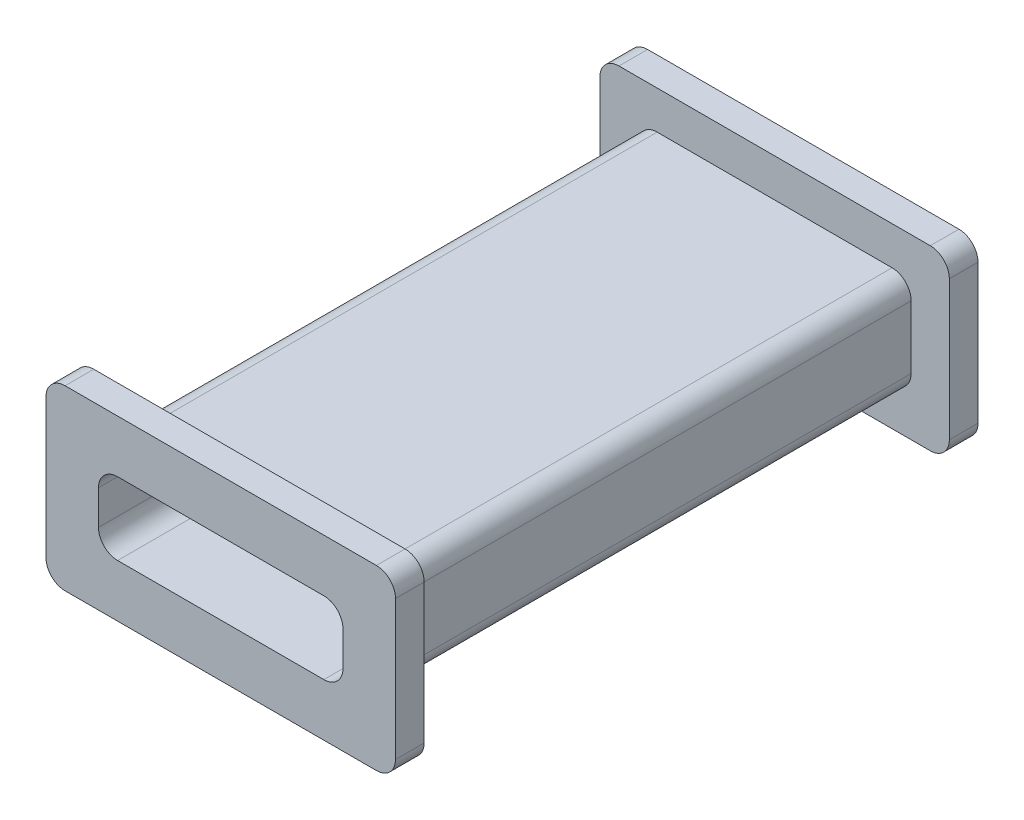
ISO-10303-21;
HEADER;
FILE_DESCRIPTION(('STEP AP214'),'2;1');
FILE_NAME('part.step','',(''),(''),'','','');
FILE_SCHEMA(('AUTOMOTIVE_DESIGN { 1 0 10303 214 1 1 1 1 }'));
ENDSEC;
DATA;
#1=APPLICATION_CONTEXT('core data for automotive mechanical design processes');
#2=APPLICATION_PROTOCOL_DEFINITION('international standard','automotive_design',2000,#1);
#3=PRODUCT_CONTEXT('',#1,'mechanical');
#4=PRODUCT('Part','Part','',(#3));
#5=PRODUCT_RELATED_PRODUCT_CATEGORY('part','',(#4));
#6=PRODUCT_DEFINITION_FORMATION('','',#4);
#7=PRODUCT_DEFINITION_CONTEXT('part definition',#1,'design');
#8=PRODUCT_DEFINITION('design','',#6,#7);
#9=PRODUCT_DEFINITION_SHAPE('','',#8);
#10=(LENGTH_UNIT() NAMED_UNIT(*) SI_UNIT(.MILLI.,.METRE.));
#11=(NAMED_UNIT(*) PLANE_ANGLE_UNIT() SI_UNIT($,.RADIAN.));
#12=(NAMED_UNIT(*) SI_UNIT($,.STERADIAN.) SOLID_ANGLE_UNIT());
#13=UNCERTAINTY_MEASURE_WITH_UNIT(LENGTH_MEASURE(1.E-05),#10,'distance_accuracy_value','');
#14=(GEOMETRIC_REPRESENTATION_CONTEXT(3) GLOBAL_UNCERTAINTY_ASSIGNED_CONTEXT((#13)) GLOBAL_UNIT_ASSIGNED_CONTEXT((#10,
#11,#12)) REPRESENTATION_CONTEXT('',''));
#15=CARTESIAN_POINT('',(0.,0.,0.));
#16=DIRECTION('',(0.,0.,1.));
#17=DIRECTION('',(1.,0.,0.));
#18=AXIS2_PLACEMENT_3D('',#15,#16,#17);
#19=CARTESIAN_POINT('',(14.3,-5.3,55.));
#20=DIRECTION('',(-1.,0.,0.));
#21=DIRECTION('',(0.,0.,1.));
#22=AXIS2_PLACEMENT_3D('',#19,#20,#21);
#23=PLANE('',#22);
#24=DIRECTION('',(0.,1.,0.));
#25=VECTOR('',#24,1.);
#26=CARTESIAN_POINT('',(14.3,-5.3,55.));
#27=LINE('',#26,#25);
#28=CARTESIAN_POINT('',(14.3,-3.3,55.));
#29=VERTEX_POINT('',#28);
#30=CARTESIAN_POINT('',(14.3,3.3,55.));
#31=VERTEX_POINT('',#30);
#32=EDGE_CURVE('E433',#29,#31,#27,.T.);
#33=ORIENTED_EDGE('',*,*,#32,.F.);
#34=DIRECTION('',(0.,0.,-1.));
#35=VECTOR('',#34,1.);
#36=CARTESIAN_POINT('',(14.3,-3.3,55.));
#37=LINE('',#36,#35);
#38=CARTESIAN_POINT('',(14.3,-3.3,0.));
#39=VERTEX_POINT('',#38);
#40=EDGE_CURVE('E256',#29,#39,#37,.T.);
#41=ORIENTED_EDGE('',*,*,#40,.T.);
#42=DIRECTION('',(0.,1.,0.));
#43=VECTOR('',#42,1.);
#44=CARTESIAN_POINT('',(14.3,-5.3,0.));
#45=LINE('',#44,#43);
#46=CARTESIAN_POINT('',(14.3,3.3,0.));
#47=VERTEX_POINT('',#46);
#48=EDGE_CURVE('E261',#39,#47,#45,.T.);
#49=ORIENTED_EDGE('',*,*,#48,.T.);
#50=DIRECTION('',(0.,0.,-1.));
#51=VECTOR('',#50,1.);
#52=CARTESIAN_POINT('',(14.3,3.3,55.));
#53=LINE('',#52,#51);
#54=EDGE_CURVE('E245',#47,#31,#53,.F.);
#55=ORIENTED_EDGE('',*,*,#54,.T.);
#56=EDGE_LOOP('',(#33,#41,#49,#55));
#57=FACE_BOUND('',#56,.T.);
#58=ADVANCED_FACE('F36',(#57),#23,.F.);
#59=CARTESIAN_POINT('',(-14.3,5.3,55.));
#60=DIRECTION('',(0.,-1.,0.));
#61=DIRECTION('',(0.,0.,-1.));
#62=AXIS2_PLACEMENT_3D('',#59,#60,#61);
#63=PLANE('',#62);
#64=DIRECTION('',(-1.,0.,0.));
#65=VECTOR('',#64,1.);
#66=CARTESIAN_POINT('',(-14.3,5.3,0.));
#67=LINE('',#66,#65);
#68=CARTESIAN_POINT('',(12.3,5.3,0.));
#69=VERTEX_POINT('',#68);
#70=CARTESIAN_POINT('',(-12.3,5.3,0.));
#71=VERTEX_POINT('',#70);
#72=EDGE_CURVE('E265',#69,#71,#67,.T.);
#73=ORIENTED_EDGE('',*,*,#72,.T.);
#74=DIRECTION('',(0.,0.,-1.));
#75=VECTOR('',#74,1.);
#76=CARTESIAN_POINT('',(-12.3,5.3,55.));
#77=LINE('',#76,#75);
#78=CARTESIAN_POINT('',(-12.3,5.3,55.));
#79=VERTEX_POINT('',#78);
#80=EDGE_CURVE('E257',#71,#79,#77,.F.);
#81=ORIENTED_EDGE('',*,*,#80,.T.);
#82=DIRECTION('',(-1.,0.,0.));
#83=VECTOR('',#82,1.);
#84=CARTESIAN_POINT('',(-14.3,5.3,55.));
#85=LINE('',#84,#83);
#86=CARTESIAN_POINT('',(12.3,5.3,55.));
#87=VERTEX_POINT('',#86);
#88=EDGE_CURVE('E435',#87,#79,#85,.T.);
#89=ORIENTED_EDGE('',*,*,#88,.F.);
#90=DIRECTION('',(0.,0.,-1.));
#91=VECTOR('',#90,1.);
#92=CARTESIAN_POINT('',(12.3,5.3,55.));
#93=LINE('',#92,#91);
#94=EDGE_CURVE('E292',#87,#69,#93,.T.);
#95=ORIENTED_EDGE('',*,*,#94,.T.);
#96=EDGE_LOOP('',(#73,#81,#89,#95));
#97=FACE_BOUND('',#96,.T.);
#98=ADVANCED_FACE('F509',(#97),#63,.F.);
#99=CARTESIAN_POINT('',(-14.3,-5.3,55.));
#100=DIRECTION('',(1.,0.,0.));
#101=DIRECTION('',(0.,0.,-1.));
#102=AXIS2_PLACEMENT_3D('',#99,#100,#101);
#103=PLANE('',#102);
#104=DIRECTION('',(0.,-1.,0.));
#105=VECTOR('',#104,1.);
#106=CARTESIAN_POINT('',(-14.3,-5.3,0.));
#107=LINE('',#106,#105);
#108=CARTESIAN_POINT('',(-14.3,3.3,0.));
#109=VERTEX_POINT('',#108);
#110=CARTESIAN_POINT('',(-14.3,-3.3,0.));
#111=VERTEX_POINT('',#110);
#112=EDGE_CURVE('E447',#109,#111,#107,.T.);
#113=ORIENTED_EDGE('',*,*,#112,.T.);
#114=DIRECTION('',(0.,0.,-1.));
#115=VECTOR('',#114,1.);
#116=CARTESIAN_POINT('',(-14.3,-3.3,55.));
#117=LINE('',#116,#115);
#118=CARTESIAN_POINT('',(-14.3,-3.3,55.));
#119=VERTEX_POINT('',#118);
#120=EDGE_CURVE('E290',#111,#119,#117,.F.);
#121=ORIENTED_EDGE('',*,*,#120,.T.);
#122=DIRECTION('',(0.,-1.,0.));
#123=VECTOR('',#122,1.);
#124=CARTESIAN_POINT('',(-14.3,-5.3,55.));
#125=LINE('',#124,#123);
#126=CARTESIAN_POINT('',(-14.3,3.3,55.));
#127=VERTEX_POINT('',#126);
#128=EDGE_CURVE('E439',#127,#119,#125,.T.);
#129=ORIENTED_EDGE('',*,*,#128,.F.);
#130=DIRECTION('',(0.,0.,-1.));
#131=VECTOR('',#130,1.);
#132=CARTESIAN_POINT('',(-14.3,3.3,55.));
#133=LINE('',#132,#131);
#134=EDGE_CURVE('E287',#127,#109,#133,.T.);
#135=ORIENTED_EDGE('',*,*,#134,.T.);
#136=EDGE_LOOP('',(#113,#121,#129,#135));
#137=FACE_BOUND('',#136,.T.);
#138=ADVANCED_FACE('F501',(#137),#103,.F.);
#139=CARTESIAN_POINT('',(-14.3,-5.3,55.));
#140=DIRECTION('',(0.,1.,0.));
#141=DIRECTION('',(0.,0.,1.));
#142=AXIS2_PLACEMENT_3D('',#139,#140,#141);
#143=PLANE('',#142);
#144=DIRECTION('',(1.,0.,0.));
#145=VECTOR('',#144,1.);
#146=CARTESIAN_POINT('',(-14.3,-5.3,55.));
#147=LINE('',#146,#145);
#148=CARTESIAN_POINT('',(-12.3,-5.3,55.));
#149=VERTEX_POINT('',#148);
#150=CARTESIAN_POINT('',(12.3,-5.3,55.));
#151=VERTEX_POINT('',#150);
#152=EDGE_CURVE('E442',#149,#151,#147,.T.);
#153=ORIENTED_EDGE('',*,*,#152,.F.);
#154=DIRECTION('',(0.,0.,-1.));
#155=VECTOR('',#154,1.);
#156=CARTESIAN_POINT('',(-12.3,-5.3,55.));
#157=LINE('',#156,#155);
#158=CARTESIAN_POINT('',(-12.3,-5.3,0.));
#159=VERTEX_POINT('',#158);
#160=EDGE_CURVE('E274',#149,#159,#157,.T.);
#161=ORIENTED_EDGE('',*,*,#160,.T.);
#162=DIRECTION('',(1.,0.,0.));
#163=VECTOR('',#162,1.);
#164=CARTESIAN_POINT('',(-14.3,-5.3,0.));
#165=LINE('',#164,#163);
#166=CARTESIAN_POINT('',(12.3,-5.3,0.));
#167=VERTEX_POINT('',#166);
#168=EDGE_CURVE('E436',#159,#167,#165,.T.);
#169=ORIENTED_EDGE('',*,*,#168,.T.);
#170=DIRECTION('',(0.,0.,-1.));
#171=VECTOR('',#170,1.);
#172=CARTESIAN_POINT('',(12.3,-5.3,55.));
#173=LINE('',#172,#171);
#174=EDGE_CURVE('E279',#167,#151,#173,.F.);
#175=ORIENTED_EDGE('',*,*,#174,.T.);
#176=EDGE_LOOP('',(#153,#161,#169,#175));
#177=FACE_BOUND('',#176,.T.);
#178=ADVANCED_FACE('F487',(#177),#143,.F.);
#179=CARTESIAN_POINT('',(12.8,-3.8,55.));
#180=DIRECTION('',(-1.,0.,0.));
#181=DIRECTION('',(0.,0.,1.));
#182=AXIS2_PLACEMENT_3D('',#179,#180,#181);
#183=PLANE('',#182);
#184=DIRECTION('',(0.,1.,0.));
#185=VECTOR('',#184,1.);
#186=CARTESIAN_POINT('',(12.8,-3.8,-3.));
#187=LINE('',#186,#185);
#188=CARTESIAN_POINT('',(12.8,-1.8,-3.));
#189=VERTEX_POINT('',#188);
#190=CARTESIAN_POINT('',(12.8,1.8,-3.));
#191=VERTEX_POINT('',#190);
#192=EDGE_CURVE('E376',#189,#191,#187,.T.);
#193=ORIENTED_EDGE('',*,*,#192,.F.);
#194=DIRECTION('',(0.,0.,-1.));
#195=VECTOR('',#194,1.);
#196=CARTESIAN_POINT('',(12.8,-1.8,58.));
#197=LINE('',#196,#195);
#198=CARTESIAN_POINT('',(12.8,-1.8,58.));
#199=VERTEX_POINT('',#198);
#200=EDGE_CURVE('E347',#189,#199,#197,.F.);
#201=ORIENTED_EDGE('',*,*,#200,.T.);
#202=DIRECTION('',(0.,1.,0.));
#203=VECTOR('',#202,1.);
#204=CARTESIAN_POINT('',(12.8,-3.8,58.));
#205=LINE('',#204,#203);
#206=CARTESIAN_POINT('',(12.8,1.8,58.));
#207=VERTEX_POINT('',#206);
#208=EDGE_CURVE('E388',#199,#207,#205,.T.);
#209=ORIENTED_EDGE('',*,*,#208,.T.);
#210=DIRECTION('',(0.,0.,-1.));
#211=VECTOR('',#210,1.);
#212=CARTESIAN_POINT('',(12.8,1.8,-3.));
#213=LINE('',#212,#211);
#214=EDGE_CURVE('E344',#207,#191,#213,.T.);
#215=ORIENTED_EDGE('',*,*,#214,.T.);
#216=EDGE_LOOP('',(#193,#201,#209,#215));
#217=FACE_BOUND('',#216,.T.);
#218=ADVANCED_FACE('F392',(#217),#183,.T.);
#219=CARTESIAN_POINT('',(-12.8,3.8,55.));
#220=DIRECTION('',(0.,-1.,0.));
#221=DIRECTION('',(0.,0.,-1.));
#222=AXIS2_PLACEMENT_3D('',#219,#220,#221);
#223=PLANE('',#222);
#224=DIRECTION('',(-1.,0.,0.));
#225=VECTOR('',#224,1.);
#226=CARTESIAN_POINT('',(-12.8,3.8,58.));
#227=LINE('',#226,#225);
#228=CARTESIAN_POINT('',(10.8,3.8,58.));
#229=VERTEX_POINT('',#228);
#230=CARTESIAN_POINT('',(-10.8,3.8,58.));
#231=VERTEX_POINT('',#230);
#232=EDGE_CURVE('E390',#229,#231,#227,.T.);
#233=ORIENTED_EDGE('',*,*,#232,.T.);
#234=DIRECTION('',(0.,0.,-1.));
#235=VECTOR('',#234,1.);
#236=CARTESIAN_POINT('',(-10.8,3.8,-3.));
#237=LINE('',#236,#235);
#238=CARTESIAN_POINT('',(-10.8,3.8,-3.));
#239=VERTEX_POINT('',#238);
#240=EDGE_CURVE('E355',#231,#239,#237,.T.);
#241=ORIENTED_EDGE('',*,*,#240,.T.);
#242=DIRECTION('',(-1.,0.,0.));
#243=VECTOR('',#242,1.);
#244=CARTESIAN_POINT('',(-12.8,3.8,-3.));
#245=LINE('',#244,#243);
#246=CARTESIAN_POINT('',(10.8,3.8,-3.));
#247=VERTEX_POINT('',#246);
#248=EDGE_CURVE('E374',#247,#239,#245,.T.);
#249=ORIENTED_EDGE('',*,*,#248,.F.);
#250=DIRECTION('',(0.,0.,-1.));
#251=VECTOR('',#250,1.);
#252=CARTESIAN_POINT('',(10.8,3.8,58.));
#253=LINE('',#252,#251);
#254=EDGE_CURVE('E58',#247,#229,#253,.F.);
#255=ORIENTED_EDGE('',*,*,#254,.T.);
#256=EDGE_LOOP('',(#233,#241,#249,#255));
#257=FACE_BOUND('',#256,.T.);
#258=ADVANCED_FACE('F379',(#257),#223,.T.);
#259=CARTESIAN_POINT('',(-12.8,-3.8,55.));
#260=DIRECTION('',(1.,0.,0.));
#261=DIRECTION('',(0.,0.,-1.));
#262=AXIS2_PLACEMENT_3D('',#259,#260,#261);
#263=PLANE('',#262);
#264=DIRECTION('',(0.,-1.,0.));
#265=VECTOR('',#264,1.);
#266=CARTESIAN_POINT('',(-12.8,-3.8,58.));
#267=LINE('',#266,#265);
#268=CARTESIAN_POINT('',(-12.8,1.8,58.));
#269=VERTEX_POINT('',#268);
#270=CARTESIAN_POINT('',(-12.8,-1.8,58.));
#271=VERTEX_POINT('',#270);
#272=EDGE_CURVE('E396',#269,#271,#267,.T.);
#273=ORIENTED_EDGE('',*,*,#272,.T.);
#274=DIRECTION('',(0.,0.,-1.));
#275=VECTOR('',#274,1.);
#276=CARTESIAN_POINT('',(-12.8,-1.8,-3.));
#277=LINE('',#276,#275);
#278=CARTESIAN_POINT('',(-12.8,-1.8,-3.));
#279=VERTEX_POINT('',#278);
#280=EDGE_CURVE('E351',#271,#279,#277,.T.);
#281=ORIENTED_EDGE('',*,*,#280,.T.);
#282=DIRECTION('',(0.,-1.,0.));
#283=VECTOR('',#282,1.);
#284=CARTESIAN_POINT('',(-12.8,-3.8,-3.));
#285=LINE('',#284,#283);
#286=CARTESIAN_POINT('',(-12.8,1.8,-3.));
#287=VERTEX_POINT('',#286);
#288=EDGE_CURVE('E382',#287,#279,#285,.T.);
#289=ORIENTED_EDGE('',*,*,#288,.F.);
#290=DIRECTION('',(0.,0.,-1.));
#291=VECTOR('',#290,1.);
#292=CARTESIAN_POINT('',(-12.8,1.8,58.));
#293=LINE('',#292,#291);
#294=EDGE_CURVE('E349',#287,#269,#293,.F.);
#295=ORIENTED_EDGE('',*,*,#294,.T.);
#296=EDGE_LOOP('',(#273,#281,#289,#295));
#297=FACE_BOUND('',#296,.T.);
#298=ADVANCED_FACE('F578',(#297),#263,.T.);
#299=CARTESIAN_POINT('',(-12.8,-3.8,55.));
#300=DIRECTION('',(0.,1.,0.));
#301=DIRECTION('',(0.,0.,1.));
#302=AXIS2_PLACEMENT_3D('',#299,#300,#301);
#303=PLANE('',#302);
#304=DIRECTION('',(1.,0.,0.));
#305=VECTOR('',#304,1.);
#306=CARTESIAN_POINT('',(-12.8,-3.8,58.));
#307=LINE('',#306,#305);
#308=CARTESIAN_POINT('',(-10.8,-3.8,58.));
#309=VERTEX_POINT('',#308);
#310=CARTESIAN_POINT('',(10.8,-3.8,58.));
#311=VERTEX_POINT('',#310);
#312=EDGE_CURVE('E407',#309,#311,#307,.T.);
#313=ORIENTED_EDGE('',*,*,#312,.T.);
#314=DIRECTION('',(0.,0.,-1.));
#315=VECTOR('',#314,1.);
#316=CARTESIAN_POINT('',(10.8,-3.8,-3.));
#317=LINE('',#316,#315);
#318=CARTESIAN_POINT('',(10.8,-3.8,-3.));
#319=VERTEX_POINT('',#318);
#320=EDGE_CURVE('E341',#311,#319,#317,.T.);
#321=ORIENTED_EDGE('',*,*,#320,.T.);
#322=DIRECTION('',(1.,0.,0.));
#323=VECTOR('',#322,1.);
#324=CARTESIAN_POINT('',(-12.8,-3.8,-3.));
#325=LINE('',#324,#323);
#326=CARTESIAN_POINT('',(-10.8,-3.8,-3.));
#327=VERTEX_POINT('',#326);
#328=EDGE_CURVE('E580',#327,#319,#325,.T.);
#329=ORIENTED_EDGE('',*,*,#328,.F.);
#330=DIRECTION('',(0.,0.,-1.));
#331=VECTOR('',#330,1.);
#332=CARTESIAN_POINT('',(-10.8,-3.8,58.));
#333=LINE('',#332,#331);
#334=EDGE_CURVE('E339',#327,#309,#333,.F.);
#335=ORIENTED_EDGE('',*,*,#334,.T.);
#336=EDGE_LOOP('',(#313,#321,#329,#335));
#337=FACE_BOUND('',#336,.T.);
#338=ADVANCED_FACE('F646',(#337),#303,.T.);
#339=CARTESIAN_POINT('',(0.,0.,55.));
#340=DIRECTION('',(0.,0.,-1.));
#341=DIRECTION('',(-1.,0.,0.));
#342=AXIS2_PLACEMENT_3D('',#339,#340,#341);
#343=PLANE('',#342);
#344=DIRECTION('',(1.,0.,0.));
#345=VECTOR('',#344,1.);
#346=CARTESIAN_POINT('',(-18.3,-9.3,55.));
#347=LINE('',#346,#345);
#348=CARTESIAN_POINT('',(-16.3,-9.3,55.));
#349=VERTEX_POINT('',#348);
#350=CARTESIAN_POINT('',(16.3,-9.3,55.));
#351=VERTEX_POINT('',#350);
#352=EDGE_CURVE('E415',#349,#351,#347,.T.);
#353=ORIENTED_EDGE('',*,*,#352,.F.);
#354=CARTESIAN_POINT('',(-16.3,-7.3,55.));
#355=DIRECTION('',(0.,0.,-1.));
#356=DIRECTION('',(-1.,0.,0.));
#357=AXIS2_PLACEMENT_3D('',#354,#355,#356);
#358=CIRCLE('',#357,2.);
#359=CARTESIAN_POINT('',(-18.3,-7.3,55.));
#360=VERTEX_POINT('',#359);
#361=EDGE_CURVE('E460',#349,#360,#358,.T.);
#362=ORIENTED_EDGE('',*,*,#361,.T.);
#363=DIRECTION('',(0.,-1.,0.));
#364=VECTOR('',#363,1.);
#365=CARTESIAN_POINT('',(-18.3,-9.3,55.));
#366=LINE('',#365,#364);
#367=CARTESIAN_POINT('',(-18.3,7.3,55.));
#368=VERTEX_POINT('',#367);
#369=EDGE_CURVE('E428',#368,#360,#366,.T.);
#370=ORIENTED_EDGE('',*,*,#369,.F.);
#371=CARTESIAN_POINT('',(-16.3,7.3,55.));
#372=DIRECTION('',(0.,0.,-1.));
#373=DIRECTION('',(-1.,0.,0.));
#374=AXIS2_PLACEMENT_3D('',#371,#372,#373);
#375=CIRCLE('',#374,2.);
#376=CARTESIAN_POINT('',(-16.3,9.3,55.));
#377=VERTEX_POINT('',#376);
#378=EDGE_CURVE('E456',#368,#377,#375,.T.);
#379=ORIENTED_EDGE('',*,*,#378,.T.);
#380=DIRECTION('',(-1.,0.,0.));
#381=VECTOR('',#380,1.);
#382=CARTESIAN_POINT('',(-18.3,9.3,55.));
#383=LINE('',#382,#381);
#384=CARTESIAN_POINT('',(16.3,9.3,55.));
#385=VERTEX_POINT('',#384);
#386=EDGE_CURVE('E425',#385,#377,#383,.T.);
#387=ORIENTED_EDGE('',*,*,#386,.F.);
#388=CARTESIAN_POINT('',(16.3,7.3,55.));
#389=DIRECTION('',(0.,0.,-1.));
#390=DIRECTION('',(-1.,0.,0.));
#391=AXIS2_PLACEMENT_3D('',#388,#389,#390);
#392=CIRCLE('',#391,2.);
#393=CARTESIAN_POINT('',(18.3,7.3,55.));
#394=VERTEX_POINT('',#393);
#395=EDGE_CURVE('E454',#385,#394,#392,.T.);
#396=ORIENTED_EDGE('',*,*,#395,.T.);
#397=DIRECTION('',(0.,1.,0.));
#398=VECTOR('',#397,1.);
#399=CARTESIAN_POINT('',(18.3,-9.3,55.));
#400=LINE('',#399,#398);
#401=CARTESIAN_POINT('',(18.3,-7.3,55.));
#402=VERTEX_POINT('',#401);
#403=EDGE_CURVE('E410',#402,#394,#400,.T.);
#404=ORIENTED_EDGE('',*,*,#403,.F.);
#405=CARTESIAN_POINT('',(16.3,-7.3,55.));
#406=DIRECTION('',(0.,0.,-1.));
#407=DIRECTION('',(-1.,0.,0.));
#408=AXIS2_PLACEMENT_3D('',#405,#406,#407);
#409=CIRCLE('',#408,2.);
#410=EDGE_CURVE('E458',#402,#351,#409,.T.);
#411=ORIENTED_EDGE('',*,*,#410,.T.);
#412=EDGE_LOOP('',(#353,#362,#370,#379,#387,#396,#404,#411));
#413=FACE_BOUND('',#412,.T.);
#414=ORIENTED_EDGE('',*,*,#152,.T.);
#415=CARTESIAN_POINT('',(12.3,-3.3,55.));
#416=DIRECTION('',(0.,0.,-1.));
#417=DIRECTION('',(-1.,0.,0.));
#418=AXIS2_PLACEMENT_3D('',#415,#416,#417);
#419=CIRCLE('',#418,2.);
#420=EDGE_CURVE('E300',#151,#29,#419,.F.);
#421=ORIENTED_EDGE('',*,*,#420,.T.);
#422=ORIENTED_EDGE('',*,*,#32,.T.);
#423=CARTESIAN_POINT('',(12.3,3.3,55.));
#424=DIRECTION('',(0.,0.,-1.));
#425=DIRECTION('',(-1.,0.,0.));
#426=AXIS2_PLACEMENT_3D('',#423,#424,#425);
#427=CIRCLE('',#426,2.);
#428=EDGE_CURVE('E252',#31,#87,#427,.F.);
#429=ORIENTED_EDGE('',*,*,#428,.T.);
#430=ORIENTED_EDGE('',*,*,#88,.T.);
#431=CARTESIAN_POINT('',(-12.3,3.3,55.));
#432=DIRECTION('',(0.,0.,-1.));
#433=DIRECTION('',(-1.,0.,0.));
#434=AXIS2_PLACEMENT_3D('',#431,#432,#433);
#435=CIRCLE('',#434,2.);
#436=EDGE_CURVE('E298',#79,#127,#435,.F.);
#437=ORIENTED_EDGE('',*,*,#436,.T.);
#438=ORIENTED_EDGE('',*,*,#128,.T.);
#439=CARTESIAN_POINT('',(-12.3,-3.3,55.));
#440=DIRECTION('',(0.,0.,-1.));
#441=DIRECTION('',(-1.,0.,0.));
#442=AXIS2_PLACEMENT_3D('',#439,#440,#441);
#443=CIRCLE('',#442,2.);
#444=EDGE_CURVE('E296',#119,#149,#443,.F.);
#445=ORIENTED_EDGE('',*,*,#444,.T.);
#446=EDGE_LOOP('',(#414,#421,#422,#429,#430,#437,#438,#445));
#447=FACE_BOUND('',#446,.T.);
#448=ADVANCED_FACE('F492',(#413,#447),#343,.T.);
#449=CARTESIAN_POINT('',(0.,0.,58.));
#450=DIRECTION('',(0.,0.,-1.));
#451=DIRECTION('',(-1.,0.,0.));
#452=AXIS2_PLACEMENT_3D('',#449,#450,#451);
#453=PLANE('',#452);
#454=DIRECTION('',(0.,-1.,0.));
#455=VECTOR('',#454,1.);
#456=CARTESIAN_POINT('',(-18.3,-9.3,58.));
#457=LINE('',#456,#455);
#458=CARTESIAN_POINT('',(-18.3,7.3,58.));
#459=VERTEX_POINT('',#458);
#460=CARTESIAN_POINT('',(-18.3,-7.3,58.));
#461=VERTEX_POINT('',#460);
#462=EDGE_CURVE('E418',#459,#461,#457,.T.);
#463=ORIENTED_EDGE('',*,*,#462,.T.);
#464=CARTESIAN_POINT('',(-16.3,-7.3,58.));
#465=DIRECTION('',(0.,0.,-1.));
#466=DIRECTION('',(-1.,0.,0.));
#467=AXIS2_PLACEMENT_3D('',#464,#465,#466);
#468=CIRCLE('',#467,2.);
#469=CARTESIAN_POINT('',(-16.3,-9.3,58.));
#470=VERTEX_POINT('',#469);
#471=EDGE_CURVE('E473',#461,#470,#468,.F.);
#472=ORIENTED_EDGE('',*,*,#471,.T.);
#473=DIRECTION('',(1.,0.,0.));
#474=VECTOR('',#473,1.);
#475=CARTESIAN_POINT('',(-18.3,-9.3,58.));
#476=LINE('',#475,#474);
#477=CARTESIAN_POINT('',(16.3,-9.3,58.));
#478=VERTEX_POINT('',#477);
#479=EDGE_CURVE('E266',#470,#478,#476,.T.);
#480=ORIENTED_EDGE('',*,*,#479,.T.);
#481=CARTESIAN_POINT('',(16.3,-7.3,58.));
#482=DIRECTION('',(0.,0.,-1.));
#483=DIRECTION('',(-1.,0.,0.));
#484=AXIS2_PLACEMENT_3D('',#481,#482,#483);
#485=CIRCLE('',#484,2.);
#486=CARTESIAN_POINT('',(18.3,-7.3,58.));
#487=VERTEX_POINT('',#486);
#488=EDGE_CURVE('E471',#478,#487,#485,.F.);
#489=ORIENTED_EDGE('',*,*,#488,.T.);
#490=DIRECTION('',(0.,1.,0.));
#491=VECTOR('',#490,1.);
#492=CARTESIAN_POINT('',(18.3,-9.3,58.));
#493=LINE('',#492,#491);
#494=CARTESIAN_POINT('',(18.3,7.3,58.));
#495=VERTEX_POINT('',#494);
#496=EDGE_CURVE('E411',#487,#495,#493,.T.);
#497=ORIENTED_EDGE('',*,*,#496,.T.);
#498=CARTESIAN_POINT('',(16.3,7.3,58.));
#499=DIRECTION('',(0.,0.,-1.));
#500=DIRECTION('',(-1.,0.,0.));
#501=AXIS2_PLACEMENT_3D('',#498,#499,#500);
#502=CIRCLE('',#501,2.);
#503=CARTESIAN_POINT('',(16.3,9.3,58.));
#504=VERTEX_POINT('',#503);
#505=EDGE_CURVE('E467',#495,#504,#502,.F.);
#506=ORIENTED_EDGE('',*,*,#505,.T.);
#507=DIRECTION('',(-1.,0.,0.));
#508=VECTOR('',#507,1.);
#509=CARTESIAN_POINT('',(-18.3,9.3,58.));
#510=LINE('',#509,#508);
#511=CARTESIAN_POINT('',(-16.3,9.3,58.));
#512=VERTEX_POINT('',#511);
#513=EDGE_CURVE('E414',#504,#512,#510,.T.);
#514=ORIENTED_EDGE('',*,*,#513,.T.);
#515=CARTESIAN_POINT('',(-16.3,7.3,58.));
#516=DIRECTION('',(0.,0.,-1.));
#517=DIRECTION('',(-1.,0.,0.));
#518=AXIS2_PLACEMENT_3D('',#515,#516,#517);
#519=CIRCLE('',#518,2.);
#520=EDGE_CURVE('E469',#512,#459,#519,.F.);
#521=ORIENTED_EDGE('',*,*,#520,.T.);
#522=EDGE_LOOP('',(#463,#472,#480,#489,#497,#506,#514,#521));
#523=FACE_BOUND('',#522,.T.);
#524=ORIENTED_EDGE('',*,*,#208,.F.);
#525=CARTESIAN_POINT('',(10.8,-1.8,58.));
#526=DIRECTION('',(0.,0.,-1.));
#527=DIRECTION('',(-1.,0.,0.));
#528=AXIS2_PLACEMENT_3D('',#525,#526,#527);
#529=CIRCLE('',#528,2.);
#530=EDGE_CURVE('E360',#199,#311,#529,.T.);
#531=ORIENTED_EDGE('',*,*,#530,.T.);
#532=ORIENTED_EDGE('',*,*,#312,.F.);
#533=CARTESIAN_POINT('',(-10.8,-1.8,58.));
#534=DIRECTION('',(0.,0.,-1.));
#535=DIRECTION('',(-1.,0.,0.));
#536=AXIS2_PLACEMENT_3D('',#533,#534,#535);
#537=CIRCLE('',#536,2.);
#538=EDGE_CURVE('E364',#309,#271,#537,.T.);
#539=ORIENTED_EDGE('',*,*,#538,.T.);
#540=ORIENTED_EDGE('',*,*,#272,.F.);
#541=CARTESIAN_POINT('',(-10.8,1.8,58.));
#542=DIRECTION('',(0.,0.,-1.));
#543=DIRECTION('',(-1.,0.,0.));
#544=AXIS2_PLACEMENT_3D('',#541,#542,#543);
#545=CIRCLE('',#544,2.);
#546=EDGE_CURVE('E51',#269,#231,#545,.T.);
#547=ORIENTED_EDGE('',*,*,#546,.T.);
#548=ORIENTED_EDGE('',*,*,#232,.F.);
#549=CARTESIAN_POINT('',(10.8,1.8,58.));
#550=DIRECTION('',(0.,0.,-1.));
#551=DIRECTION('',(-1.,0.,0.));
#552=AXIS2_PLACEMENT_3D('',#549,#550,#551);
#553=CIRCLE('',#552,2.);
#554=EDGE_CURVE('E11',#229,#207,#553,.T.);
#555=ORIENTED_EDGE('',*,*,#554,.T.);
#556=EDGE_LOOP('',(#524,#531,#532,#539,#540,#547,#548,#555));
#557=FACE_BOUND('',#556,.T.);
#558=ADVANCED_FACE('F387',(#523,#557),#453,.F.);
#559=CARTESIAN_POINT('',(18.3,-9.3,58.));
#560=DIRECTION('',(-1.,0.,0.));
#561=DIRECTION('',(0.,0.,1.));
#562=AXIS2_PLACEMENT_3D('',#559,#560,#561);
#563=PLANE('',#562);
#564=ORIENTED_EDGE('',*,*,#496,.F.);
#565=DIRECTION('',(0.,0.,-1.));
#566=VECTOR('',#565,1.);
#567=CARTESIAN_POINT('',(18.3,-7.3,58.));
#568=LINE('',#567,#566);
#569=EDGE_CURVE('E477',#487,#402,#568,.T.);
#570=ORIENTED_EDGE('',*,*,#569,.T.);
#571=ORIENTED_EDGE('',*,*,#403,.T.);
#572=DIRECTION('',(0.,0.,-1.));
#573=VECTOR('',#572,1.);
#574=CARTESIAN_POINT('',(18.3,7.3,58.));
#575=LINE('',#574,#573);
#576=EDGE_CURVE('E475',#394,#495,#575,.F.);
#577=ORIENTED_EDGE('',*,*,#576,.T.);
#578=EDGE_LOOP('',(#564,#570,#571,#577));
#579=FACE_BOUND('',#578,.T.);
#580=ADVANCED_FACE('F642',(#579),#563,.F.);
#581=CARTESIAN_POINT('',(-18.3,9.3,58.));
#582=DIRECTION('',(0.,-1.,0.));
#583=DIRECTION('',(0.,0.,-1.));
#584=AXIS2_PLACEMENT_3D('',#581,#582,#583);
#585=PLANE('',#584);
#586=ORIENTED_EDGE('',*,*,#386,.T.);
#587=DIRECTION('',(0.,0.,-1.));
#588=VECTOR('',#587,1.);
#589=CARTESIAN_POINT('',(-16.3,9.3,58.));
#590=LINE('',#589,#588);
#591=EDGE_CURVE('E483',#377,#512,#590,.F.);
#592=ORIENTED_EDGE('',*,*,#591,.T.);
#593=ORIENTED_EDGE('',*,*,#513,.F.);
#594=DIRECTION('',(0.,0.,-1.));
#595=VECTOR('',#594,1.);
#596=CARTESIAN_POINT('',(16.3,9.3,58.));
#597=LINE('',#596,#595);
#598=EDGE_CURVE('E480',#504,#385,#597,.T.);
#599=ORIENTED_EDGE('',*,*,#598,.T.);
#600=EDGE_LOOP('',(#586,#592,#593,#599));
#601=FACE_BOUND('',#600,.T.);
#602=ADVANCED_FACE('F654',(#601),#585,.F.);
#603=CARTESIAN_POINT('',(-18.3,-9.3,58.));
#604=DIRECTION('',(1.,0.,0.));
#605=DIRECTION('',(0.,0.,-1.));
#606=AXIS2_PLACEMENT_3D('',#603,#604,#605);
#607=PLANE('',#606);
#608=ORIENTED_EDGE('',*,*,#369,.T.);
#609=DIRECTION('',(0.,0.,-1.));
#610=VECTOR('',#609,1.);
#611=CARTESIAN_POINT('',(-18.3,-7.3,58.));
#612=LINE('',#611,#610);
#613=EDGE_CURVE('E465',#360,#461,#612,.F.);
#614=ORIENTED_EDGE('',*,*,#613,.T.);
#615=ORIENTED_EDGE('',*,*,#462,.F.);
#616=DIRECTION('',(0.,0.,-1.));
#617=VECTOR('',#616,1.);
#618=CARTESIAN_POINT('',(-18.3,7.3,58.));
#619=LINE('',#618,#617);
#620=EDGE_CURVE('E462',#459,#368,#619,.T.);
#621=ORIENTED_EDGE('',*,*,#620,.T.);
#622=EDGE_LOOP('',(#608,#614,#615,#621));
#623=FACE_BOUND('',#622,.T.);
#624=ADVANCED_FACE('F650',(#623),#607,.F.);
#625=CARTESIAN_POINT('',(-18.3,-9.3,58.));
#626=DIRECTION('',(0.,1.,0.));
#627=DIRECTION('',(0.,0.,1.));
#628=AXIS2_PLACEMENT_3D('',#625,#626,#627);
#629=PLANE('',#628);
#630=ORIENTED_EDGE('',*,*,#479,.F.);
#631=DIRECTION('',(0.,0.,-1.));
#632=VECTOR('',#631,1.);
#633=CARTESIAN_POINT('',(-16.3,-9.3,58.));
#634=LINE('',#633,#632);
#635=EDGE_CURVE('E451',#470,#349,#634,.T.);
#636=ORIENTED_EDGE('',*,*,#635,.T.);
#637=ORIENTED_EDGE('',*,*,#352,.T.);
#638=DIRECTION('',(0.,0.,-1.));
#639=VECTOR('',#638,1.);
#640=CARTESIAN_POINT('',(16.3,-9.3,58.));
#641=LINE('',#640,#639);
#642=EDGE_CURVE('E444',#351,#478,#641,.F.);
#643=ORIENTED_EDGE('',*,*,#642,.T.);
#644=EDGE_LOOP('',(#630,#636,#637,#643));
#645=FACE_BOUND('',#644,.T.);
#646=ADVANCED_FACE('F524',(#645),#629,.F.);
#647=CARTESIAN_POINT('',(-16.3,-7.3,58.));
#648=DIRECTION('',(0.,0.,-1.));
#649=DIRECTION('',(-1.,0.,0.));
#650=AXIS2_PLACEMENT_3D('',#647,#648,#649);
#651=CYLINDRICAL_SURFACE('',#650,2.);
#652=ORIENTED_EDGE('',*,*,#471,.F.);
#653=ORIENTED_EDGE('',*,*,#613,.F.);
#654=ORIENTED_EDGE('',*,*,#361,.F.);
#655=ORIENTED_EDGE('',*,*,#635,.F.);
#656=EDGE_LOOP('',(#652,#653,#654,#655));
#657=FACE_BOUND('',#656,.T.);
#658=ADVANCED_FACE('F520',(#657),#651,.T.);
#659=CARTESIAN_POINT('',(16.3,-7.3,58.));
#660=DIRECTION('',(0.,0.,-1.));
#661=DIRECTION('',(-1.,0.,0.));
#662=AXIS2_PLACEMENT_3D('',#659,#660,#661);
#663=CYLINDRICAL_SURFACE('',#662,2.);
#664=ORIENTED_EDGE('',*,*,#488,.F.);
#665=ORIENTED_EDGE('',*,*,#642,.F.);
#666=ORIENTED_EDGE('',*,*,#410,.F.);
#667=ORIENTED_EDGE('',*,*,#569,.F.);
#668=EDGE_LOOP('',(#664,#665,#666,#667));
#669=FACE_BOUND('',#668,.T.);
#670=ADVANCED_FACE('F523',(#669),#663,.T.);
#671=CARTESIAN_POINT('',(-16.3,7.3,58.));
#672=DIRECTION('',(0.,0.,-1.));
#673=DIRECTION('',(-1.,0.,0.));
#674=AXIS2_PLACEMENT_3D('',#671,#672,#673);
#675=CYLINDRICAL_SURFACE('',#674,2.);
#676=ORIENTED_EDGE('',*,*,#520,.F.);
#677=ORIENTED_EDGE('',*,*,#591,.F.);
#678=ORIENTED_EDGE('',*,*,#378,.F.);
#679=ORIENTED_EDGE('',*,*,#620,.F.);
#680=EDGE_LOOP('',(#676,#677,#678,#679));
#681=FACE_BOUND('',#680,.T.);
#682=ADVANCED_FACE('F528',(#681),#675,.T.);
#683=CARTESIAN_POINT('',(16.3,7.3,58.));
#684=DIRECTION('',(0.,0.,-1.));
#685=DIRECTION('',(-1.,0.,0.));
#686=AXIS2_PLACEMENT_3D('',#683,#684,#685);
#687=CYLINDRICAL_SURFACE('',#686,2.);
#688=ORIENTED_EDGE('',*,*,#505,.F.);
#689=ORIENTED_EDGE('',*,*,#576,.F.);
#690=ORIENTED_EDGE('',*,*,#395,.F.);
#691=ORIENTED_EDGE('',*,*,#598,.F.);
#692=EDGE_LOOP('',(#688,#689,#690,#691));
#693=FACE_BOUND('',#692,.T.);
#694=ADVANCED_FACE('F532',(#693),#687,.T.);
#695=CARTESIAN_POINT('',(-12.3,-3.3,55.));
#696=DIRECTION('',(0.,0.,-1.));
#697=DIRECTION('',(-1.,0.,0.));
#698=AXIS2_PLACEMENT_3D('',#695,#696,#697);
#699=CYLINDRICAL_SURFACE('',#698,2.);
#700=ORIENTED_EDGE('',*,*,#444,.F.);
#701=ORIENTED_EDGE('',*,*,#120,.F.);
#702=CARTESIAN_POINT('',(-12.3,-3.3,0.));
#703=DIRECTION('',(0.,0.,-1.));
#704=DIRECTION('',(-1.,0.,0.));
#705=AXIS2_PLACEMENT_3D('',#702,#703,#704);
#706=CIRCLE('',#705,2.);
#707=EDGE_CURVE('E284',#159,#111,#706,.T.);
#708=ORIENTED_EDGE('',*,*,#707,.F.);
#709=ORIENTED_EDGE('',*,*,#160,.F.);
#710=EDGE_LOOP('',(#700,#701,#708,#709));
#711=FACE_BOUND('',#710,.T.);
#712=ADVANCED_FACE('F498',(#711),#699,.T.);
#713=CARTESIAN_POINT('',(-12.3,3.3,55.));
#714=DIRECTION('',(0.,0.,-1.));
#715=DIRECTION('',(-1.,0.,0.));
#716=AXIS2_PLACEMENT_3D('',#713,#714,#715);
#717=CYLINDRICAL_SURFACE('',#716,2.);
#718=ORIENTED_EDGE('',*,*,#436,.F.);
#719=ORIENTED_EDGE('',*,*,#80,.F.);
#720=CARTESIAN_POINT('',(-12.3,3.3,0.));
#721=DIRECTION('',(0.,0.,-1.));
#722=DIRECTION('',(-1.,0.,0.));
#723=AXIS2_PLACEMENT_3D('',#720,#721,#722);
#724=CIRCLE('',#723,2.);
#725=EDGE_CURVE('E276',#109,#71,#724,.T.);
#726=ORIENTED_EDGE('',*,*,#725,.F.);
#727=ORIENTED_EDGE('',*,*,#134,.F.);
#728=EDGE_LOOP('',(#718,#719,#726,#727));
#729=FACE_BOUND('',#728,.T.);
#730=ADVANCED_FACE('F507',(#729),#717,.T.);
#731=CARTESIAN_POINT('',(12.3,-3.3,55.));
#732=DIRECTION('',(0.,0.,-1.));
#733=DIRECTION('',(-1.,0.,0.));
#734=AXIS2_PLACEMENT_3D('',#731,#732,#733);
#735=CYLINDRICAL_SURFACE('',#734,2.);
#736=ORIENTED_EDGE('',*,*,#420,.F.);
#737=ORIENTED_EDGE('',*,*,#174,.F.);
#738=CARTESIAN_POINT('',(12.3,-3.3,0.));
#739=DIRECTION('',(0.,0.,-1.));
#740=DIRECTION('',(-1.,0.,0.));
#741=AXIS2_PLACEMENT_3D('',#738,#739,#740);
#742=CIRCLE('',#741,2.);
#743=EDGE_CURVE('E273',#39,#167,#742,.T.);
#744=ORIENTED_EDGE('',*,*,#743,.F.);
#745=ORIENTED_EDGE('',*,*,#40,.F.);
#746=EDGE_LOOP('',(#736,#737,#744,#745));
#747=FACE_BOUND('',#746,.T.);
#748=ADVANCED_FACE('F494',(#747),#735,.T.);
#749=CARTESIAN_POINT('',(12.3,3.3,55.));
#750=DIRECTION('',(0.,0.,-1.));
#751=DIRECTION('',(-1.,0.,0.));
#752=AXIS2_PLACEMENT_3D('',#749,#750,#751);
#753=CYLINDRICAL_SURFACE('',#752,2.);
#754=ORIENTED_EDGE('',*,*,#428,.F.);
#755=ORIENTED_EDGE('',*,*,#54,.F.);
#756=CARTESIAN_POINT('',(12.3,3.3,0.));
#757=DIRECTION('',(0.,0.,-1.));
#758=DIRECTION('',(-1.,0.,0.));
#759=AXIS2_PLACEMENT_3D('',#756,#757,#758);
#760=CIRCLE('',#759,2.);
#761=EDGE_CURVE('E250',#69,#47,#760,.T.);
#762=ORIENTED_EDGE('',*,*,#761,.F.);
#763=ORIENTED_EDGE('',*,*,#94,.F.);
#764=EDGE_LOOP('',(#754,#755,#762,#763));
#765=FACE_BOUND('',#764,.T.);
#766=ADVANCED_FACE('F247',(#765),#753,.T.);
#767=CARTESIAN_POINT('',(18.3,-9.3,-3.));
#768=DIRECTION('',(1.,0.,0.));
#769=DIRECTION('',(0.,0.,-1.));
#770=AXIS2_PLACEMENT_3D('',#767,#768,#769);
#771=PLANE('',#770);
#772=DIRECTION('',(0.,1.,0.));
#773=VECTOR('',#772,1.);
#774=CARTESIAN_POINT('',(18.3,-9.3,0.));
#775=LINE('',#774,#773);
#776=CARTESIAN_POINT('',(18.3,-7.3,0.));
#777=VERTEX_POINT('',#776);
#778=CARTESIAN_POINT('',(18.3,7.3,0.));
#779=VERTEX_POINT('',#778);
#780=EDGE_CURVE('E381',#777,#779,#775,.T.);
#781=ORIENTED_EDGE('',*,*,#780,.F.);
#782=DIRECTION('',(0.,0.,1.));
#783=VECTOR('',#782,1.);
#784=CARTESIAN_POINT('',(18.3,-7.3,-3.));
#785=LINE('',#784,#783);
#786=CARTESIAN_POINT('',(18.3,-7.3,-3.));
#787=VERTEX_POINT('',#786);
#788=EDGE_CURVE('E332',#777,#787,#785,.F.);
#789=ORIENTED_EDGE('',*,*,#788,.T.);
#790=DIRECTION('',(0.,1.,0.));
#791=VECTOR('',#790,1.);
#792=CARTESIAN_POINT('',(18.3,-9.3,-3.));
#793=LINE('',#792,#791);
#794=CARTESIAN_POINT('',(18.3,7.3,-3.));
#795=VERTEX_POINT('',#794);
#796=EDGE_CURVE('E586',#787,#795,#793,.T.);
#797=ORIENTED_EDGE('',*,*,#796,.T.);
#798=DIRECTION('',(0.,0.,1.));
#799=VECTOR('',#798,1.);
#800=CARTESIAN_POINT('',(18.3,7.3,-3.));
#801=LINE('',#800,#799);
#802=EDGE_CURVE('E329',#795,#779,#801,.T.);
#803=ORIENTED_EDGE('',*,*,#802,.T.);
#804=EDGE_LOOP('',(#781,#789,#797,#803));
#805=FACE_BOUND('',#804,.T.);
#806=ADVANCED_FACE('F545',(#805),#771,.T.);
#807=CARTESIAN_POINT('',(-18.3,-9.3,-3.));
#808=DIRECTION('',(0.,-1.,0.));
#809=DIRECTION('',(0.,0.,-1.));
#810=AXIS2_PLACEMENT_3D('',#807,#808,#809);
#811=PLANE('',#810);
#812=DIRECTION('',(1.,0.,0.));
#813=VECTOR('',#812,1.);
#814=CARTESIAN_POINT('',(-18.3,-9.3,0.));
#815=LINE('',#814,#813);
#816=CARTESIAN_POINT('',(-16.3,-9.3,0.));
#817=VERTEX_POINT('',#816);
#818=CARTESIAN_POINT('',(16.3,-9.3,0.));
#819=VERTEX_POINT('',#818);
#820=EDGE_CURVE('E596',#817,#819,#815,.T.);
#821=ORIENTED_EDGE('',*,*,#820,.F.);
#822=DIRECTION('',(0.,0.,1.));
#823=VECTOR('',#822,1.);
#824=CARTESIAN_POINT('',(-16.3,-9.3,-3.));
#825=LINE('',#824,#823);
#826=CARTESIAN_POINT('',(-16.3,-9.3,-3.));
#827=VERTEX_POINT('',#826);
#828=EDGE_CURVE('E319',#817,#827,#825,.F.);
#829=ORIENTED_EDGE('',*,*,#828,.T.);
#830=DIRECTION('',(1.,0.,0.));
#831=VECTOR('',#830,1.);
#832=CARTESIAN_POINT('',(-18.3,-9.3,-3.));
#833=LINE('',#832,#831);
#834=CARTESIAN_POINT('',(16.3,-9.3,-3.));
#835=VERTEX_POINT('',#834);
#836=EDGE_CURVE('E589',#827,#835,#833,.T.);
#837=ORIENTED_EDGE('',*,*,#836,.T.);
#838=DIRECTION('',(0.,0.,1.));
#839=VECTOR('',#838,1.);
#840=CARTESIAN_POINT('',(16.3,-9.3,-3.));
#841=LINE('',#840,#839);
#842=EDGE_CURVE('E316',#835,#819,#841,.T.);
#843=ORIENTED_EDGE('',*,*,#842,.T.);
#844=EDGE_LOOP('',(#821,#829,#837,#843));
#845=FACE_BOUND('',#844,.T.);
#846=ADVANCED_FACE('F620',(#845),#811,.T.);
#847=CARTESIAN_POINT('',(-18.3,-9.3,-3.));
#848=DIRECTION('',(-1.,0.,0.));
#849=DIRECTION('',(0.,0.,1.));
#850=AXIS2_PLACEMENT_3D('',#847,#848,#849);
#851=PLANE('',#850);
#852=DIRECTION('',(0.,-1.,0.));
#853=VECTOR('',#852,1.);
#854=CARTESIAN_POINT('',(-18.3,-9.3,-3.));
#855=LINE('',#854,#853);
#856=CARTESIAN_POINT('',(-18.3,7.3,-3.));
#857=VERTEX_POINT('',#856);
#858=CARTESIAN_POINT('',(-18.3,-7.3,-3.));
#859=VERTEX_POINT('',#858);
#860=EDGE_CURVE('E399',#857,#859,#855,.T.);
#861=ORIENTED_EDGE('',*,*,#860,.T.);
#862=DIRECTION('',(0.,0.,1.));
#863=VECTOR('',#862,1.);
#864=CARTESIAN_POINT('',(-18.3,-7.3,-3.));
#865=LINE('',#864,#863);
#866=CARTESIAN_POINT('',(-18.3,-7.3,0.));
#867=VERTEX_POINT('',#866);
#868=EDGE_CURVE('E305',#859,#867,#865,.T.);
#869=ORIENTED_EDGE('',*,*,#868,.T.);
#870=DIRECTION('',(0.,-1.,0.));
#871=VECTOR('',#870,1.);
#872=CARTESIAN_POINT('',(-18.3,-9.3,0.));
#873=LINE('',#872,#871);
#874=CARTESIAN_POINT('',(-18.3,7.3,0.));
#875=VERTEX_POINT('',#874);
#876=EDGE_CURVE('E598',#875,#867,#873,.T.);
#877=ORIENTED_EDGE('',*,*,#876,.F.);
#878=DIRECTION('',(0.,0.,1.));
#879=VECTOR('',#878,1.);
#880=CARTESIAN_POINT('',(-18.3,7.3,-3.));
#881=LINE('',#880,#879);
#882=EDGE_CURVE('E303',#875,#857,#881,.F.);
#883=ORIENTED_EDGE('',*,*,#882,.T.);
#884=EDGE_LOOP('',(#861,#869,#877,#883));
#885=FACE_BOUND('',#884,.T.);
#886=ADVANCED_FACE('F626',(#885),#851,.T.);
#887=CARTESIAN_POINT('',(-18.3,9.3,-3.));
#888=DIRECTION('',(0.,1.,0.));
#889=DIRECTION('',(0.,0.,1.));
#890=AXIS2_PLACEMENT_3D('',#887,#888,#889);
#891=PLANE('',#890);
#892=DIRECTION('',(-1.,0.,0.));
#893=VECTOR('',#892,1.);
#894=CARTESIAN_POINT('',(-18.3,9.3,-3.));
#895=LINE('',#894,#893);
#896=CARTESIAN_POINT('',(16.3,9.3,-3.));
#897=VERTEX_POINT('',#896);
#898=CARTESIAN_POINT('',(-16.3,9.3,-3.));
#899=VERTEX_POINT('',#898);
#900=EDGE_CURVE('E394',#897,#899,#895,.T.);
#901=ORIENTED_EDGE('',*,*,#900,.T.);
#902=DIRECTION('',(0.,0.,1.));
#903=VECTOR('',#902,1.);
#904=CARTESIAN_POINT('',(-16.3,9.3,-3.));
#905=LINE('',#904,#903);
#906=CARTESIAN_POINT('',(-16.3,9.3,0.));
#907=VERTEX_POINT('',#906);
#908=EDGE_CURVE('E336',#899,#907,#905,.T.);
#909=ORIENTED_EDGE('',*,*,#908,.T.);
#910=DIRECTION('',(-1.,0.,0.));
#911=VECTOR('',#910,1.);
#912=CARTESIAN_POINT('',(-18.3,9.3,0.));
#913=LINE('',#912,#911);
#914=CARTESIAN_POINT('',(16.3,9.3,0.));
#915=VERTEX_POINT('',#914);
#916=EDGE_CURVE('E402',#915,#907,#913,.T.);
#917=ORIENTED_EDGE('',*,*,#916,.F.);
#918=DIRECTION('',(0.,0.,1.));
#919=VECTOR('',#918,1.);
#920=CARTESIAN_POINT('',(16.3,9.3,-3.));
#921=LINE('',#920,#919);
#922=EDGE_CURVE('E334',#915,#897,#921,.F.);
#923=ORIENTED_EDGE('',*,*,#922,.T.);
#924=EDGE_LOOP('',(#901,#909,#917,#923));
#925=FACE_BOUND('',#924,.T.);
#926=ADVANCED_FACE('F605',(#925),#891,.T.);
#927=CARTESIAN_POINT('',(0.,0.,-3.));
#928=DIRECTION('',(0.,0.,1.));
#929=DIRECTION('',(-1.,0.,0.));
#930=AXIS2_PLACEMENT_3D('',#927,#928,#929);
#931=PLANE('',#930);
#932=ORIENTED_EDGE('',*,*,#288,.T.);
#933=CARTESIAN_POINT('',(-10.8,-1.8,-3.));
#934=DIRECTION('',(0.,0.,1.));
#935=DIRECTION('',(1.,0.,0.));
#936=AXIS2_PLACEMENT_3D('',#933,#934,#935);
#937=CIRCLE('',#936,2.);
#938=EDGE_CURVE('E362',#279,#327,#937,.T.);
#939=ORIENTED_EDGE('',*,*,#938,.T.);
#940=ORIENTED_EDGE('',*,*,#328,.T.);
#941=CARTESIAN_POINT('',(10.8,-1.8,-3.));
#942=DIRECTION('',(0.,0.,1.));
#943=DIRECTION('',(1.,0.,0.));
#944=AXIS2_PLACEMENT_3D('',#941,#942,#943);
#945=CIRCLE('',#944,2.);
#946=EDGE_CURVE('E358',#319,#189,#945,.T.);
#947=ORIENTED_EDGE('',*,*,#946,.T.);
#948=ORIENTED_EDGE('',*,*,#192,.T.);
#949=CARTESIAN_POINT('',(10.8,1.8,-3.));
#950=DIRECTION('',(0.,0.,1.));
#951=DIRECTION('',(1.,0.,0.));
#952=AXIS2_PLACEMENT_3D('',#949,#950,#951);
#953=CIRCLE('',#952,2.);
#954=EDGE_CURVE('E44',#191,#247,#953,.T.);
#955=ORIENTED_EDGE('',*,*,#954,.T.);
#956=ORIENTED_EDGE('',*,*,#248,.T.);
#957=CARTESIAN_POINT('',(-10.8,1.8,-3.));
#958=DIRECTION('',(0.,0.,1.));
#959=DIRECTION('',(1.,0.,0.));
#960=AXIS2_PLACEMENT_3D('',#957,#958,#959);
#961=CIRCLE('',#960,2.);
#962=EDGE_CURVE('E366',#239,#287,#961,.T.);
#963=ORIENTED_EDGE('',*,*,#962,.T.);
#964=EDGE_LOOP('',(#932,#939,#940,#947,#948,#955,#956,#963));
#965=FACE_BOUND('',#964,.T.);
#966=ORIENTED_EDGE('',*,*,#836,.F.);
#967=CARTESIAN_POINT('',(-16.3,-7.3,-3.));
#968=DIRECTION('',(0.,0.,1.));
#969=DIRECTION('',(1.,0.,0.));
#970=AXIS2_PLACEMENT_3D('',#967,#968,#969);
#971=CIRCLE('',#970,2.);
#972=EDGE_CURVE('E327',#827,#859,#971,.F.);
#973=ORIENTED_EDGE('',*,*,#972,.T.);
#974=ORIENTED_EDGE('',*,*,#860,.F.);
#975=CARTESIAN_POINT('',(-16.3,7.3,-3.));
#976=DIRECTION('',(0.,0.,1.));
#977=DIRECTION('',(1.,0.,0.));
#978=AXIS2_PLACEMENT_3D('',#975,#976,#977);
#979=CIRCLE('',#978,2.);
#980=EDGE_CURVE('E323',#857,#899,#979,.F.);
#981=ORIENTED_EDGE('',*,*,#980,.T.);
#982=ORIENTED_EDGE('',*,*,#900,.F.);
#983=CARTESIAN_POINT('',(16.3,7.3,-3.));
#984=DIRECTION('',(0.,0.,1.));
#985=DIRECTION('',(1.,0.,0.));
#986=AXIS2_PLACEMENT_3D('',#983,#984,#985);
#987=CIRCLE('',#986,2.);
#988=EDGE_CURVE('E321',#897,#795,#987,.F.);
#989=ORIENTED_EDGE('',*,*,#988,.T.);
#990=ORIENTED_EDGE('',*,*,#796,.F.);
#991=CARTESIAN_POINT('',(16.3,-7.3,-3.));
#992=DIRECTION('',(0.,0.,1.));
#993=DIRECTION('',(1.,0.,0.));
#994=AXIS2_PLACEMENT_3D('',#991,#992,#993);
#995=CIRCLE('',#994,2.);
#996=EDGE_CURVE('E325',#787,#835,#995,.F.);
#997=ORIENTED_EDGE('',*,*,#996,.T.);
#998=EDGE_LOOP('',(#966,#973,#974,#981,#982,#989,#990,#997));
#999=FACE_BOUND('',#998,.T.);
#1000=ADVANCED_FACE('F372',(#965,#999),#931,.F.);
#1001=CARTESIAN_POINT('',(0.,0.,0.));
#1002=DIRECTION('',(0.,0.,1.));
#1003=DIRECTION('',(-1.,0.,0.));
#1004=AXIS2_PLACEMENT_3D('',#1001,#1002,#1003);
#1005=PLANE('',#1004);
#1006=ORIENTED_EDGE('',*,*,#168,.F.);
#1007=ORIENTED_EDGE('',*,*,#707,.T.);
#1008=ORIENTED_EDGE('',*,*,#112,.F.);
#1009=ORIENTED_EDGE('',*,*,#725,.T.);
#1010=ORIENTED_EDGE('',*,*,#72,.F.);
#1011=ORIENTED_EDGE('',*,*,#761,.T.);
#1012=ORIENTED_EDGE('',*,*,#48,.F.);
#1013=ORIENTED_EDGE('',*,*,#743,.T.);
#1014=EDGE_LOOP('',(#1006,#1007,#1008,#1009,#1010,#1011,#1012,#1013));
#1015=FACE_BOUND('',#1014,.T.);
#1016=ORIENTED_EDGE('',*,*,#876,.T.);
#1017=CARTESIAN_POINT('',(-16.3,-7.3,0.));
#1018=DIRECTION('',(0.,0.,1.));
#1019=DIRECTION('',(1.,0.,0.));
#1020=AXIS2_PLACEMENT_3D('',#1017,#1018,#1019);
#1021=CIRCLE('',#1020,2.);
#1022=EDGE_CURVE('E314',#867,#817,#1021,.T.);
#1023=ORIENTED_EDGE('',*,*,#1022,.T.);
#1024=ORIENTED_EDGE('',*,*,#820,.T.);
#1025=CARTESIAN_POINT('',(16.3,-7.3,0.));
#1026=DIRECTION('',(0.,0.,1.));
#1027=DIRECTION('',(1.,0.,0.));
#1028=AXIS2_PLACEMENT_3D('',#1025,#1026,#1027);
#1029=CIRCLE('',#1028,2.);
#1030=EDGE_CURVE('E312',#819,#777,#1029,.T.);
#1031=ORIENTED_EDGE('',*,*,#1030,.T.);
#1032=ORIENTED_EDGE('',*,*,#780,.T.);
#1033=CARTESIAN_POINT('',(16.3,7.3,0.));
#1034=DIRECTION('',(0.,0.,1.));
#1035=DIRECTION('',(1.,0.,0.));
#1036=AXIS2_PLACEMENT_3D('',#1033,#1034,#1035);
#1037=CIRCLE('',#1036,2.);
#1038=EDGE_CURVE('E308',#779,#915,#1037,.T.);
#1039=ORIENTED_EDGE('',*,*,#1038,.T.);
#1040=ORIENTED_EDGE('',*,*,#916,.T.);
#1041=CARTESIAN_POINT('',(-16.3,7.3,0.));
#1042=DIRECTION('',(0.,0.,1.));
#1043=DIRECTION('',(1.,0.,0.));
#1044=AXIS2_PLACEMENT_3D('',#1041,#1042,#1043);
#1045=CIRCLE('',#1044,2.);
#1046=EDGE_CURVE('E310',#907,#875,#1045,.T.);
#1047=ORIENTED_EDGE('',*,*,#1046,.T.);
#1048=EDGE_LOOP('',(#1016,#1023,#1024,#1031,#1032,#1039,#1040,#1047));
#1049=FACE_BOUND('',#1048,.T.);
#1050=ADVANCED_FACE('F270',(#1015,#1049),#1005,.T.);
#1051=CARTESIAN_POINT('',(-16.3,-7.3,-3.));
#1052=DIRECTION('',(0.,0.,1.));
#1053=DIRECTION('',(1.,0.,0.));
#1054=AXIS2_PLACEMENT_3D('',#1051,#1052,#1053);
#1055=CYLINDRICAL_SURFACE('',#1054,2.);
#1056=ORIENTED_EDGE('',*,*,#972,.F.);
#1057=ORIENTED_EDGE('',*,*,#828,.F.);
#1058=ORIENTED_EDGE('',*,*,#1022,.F.);
#1059=ORIENTED_EDGE('',*,*,#868,.F.);
#1060=EDGE_LOOP('',(#1056,#1057,#1058,#1059));
#1061=FACE_BOUND('',#1060,.T.);
#1062=ADVANCED_FACE('F546',(#1061),#1055,.T.);
#1063=CARTESIAN_POINT('',(16.3,-7.3,-3.));
#1064=DIRECTION('',(0.,0.,1.));
#1065=DIRECTION('',(1.,0.,0.));
#1066=AXIS2_PLACEMENT_3D('',#1063,#1064,#1065);
#1067=CYLINDRICAL_SURFACE('',#1066,2.);
#1068=ORIENTED_EDGE('',*,*,#996,.F.);
#1069=ORIENTED_EDGE('',*,*,#788,.F.);
#1070=ORIENTED_EDGE('',*,*,#1030,.F.);
#1071=ORIENTED_EDGE('',*,*,#842,.F.);
#1072=EDGE_LOOP('',(#1068,#1069,#1070,#1071));
#1073=FACE_BOUND('',#1072,.T.);
#1074=ADVANCED_FACE('F549',(#1073),#1067,.T.);
#1075=CARTESIAN_POINT('',(-16.3,7.3,-3.));
#1076=DIRECTION('',(0.,0.,1.));
#1077=DIRECTION('',(1.,0.,0.));
#1078=AXIS2_PLACEMENT_3D('',#1075,#1076,#1077);
#1079=CYLINDRICAL_SURFACE('',#1078,2.);
#1080=ORIENTED_EDGE('',*,*,#980,.F.);
#1081=ORIENTED_EDGE('',*,*,#882,.F.);
#1082=ORIENTED_EDGE('',*,*,#1046,.F.);
#1083=ORIENTED_EDGE('',*,*,#908,.F.);
#1084=EDGE_LOOP('',(#1080,#1081,#1082,#1083));
#1085=FACE_BOUND('',#1084,.T.);
#1086=ADVANCED_FACE('F553',(#1085),#1079,.T.);
#1087=CARTESIAN_POINT('',(16.3,7.3,-3.));
#1088=DIRECTION('',(0.,0.,1.));
#1089=DIRECTION('',(1.,0.,0.));
#1090=AXIS2_PLACEMENT_3D('',#1087,#1088,#1089);
#1091=CYLINDRICAL_SURFACE('',#1090,2.);
#1092=ORIENTED_EDGE('',*,*,#988,.F.);
#1093=ORIENTED_EDGE('',*,*,#922,.F.);
#1094=ORIENTED_EDGE('',*,*,#1038,.F.);
#1095=ORIENTED_EDGE('',*,*,#802,.F.);
#1096=EDGE_LOOP('',(#1092,#1093,#1094,#1095));
#1097=FACE_BOUND('',#1096,.T.);
#1098=ADVANCED_FACE('F557',(#1097),#1091,.T.);
#1099=CARTESIAN_POINT('',(10.8,-1.8,55.));
#1100=DIRECTION('',(0.,0.,1.));
#1101=DIRECTION('',(1.,0.,0.));
#1102=AXIS2_PLACEMENT_3D('',#1099,#1100,#1101);
#1103=CYLINDRICAL_SURFACE('',#1102,2.);
#1104=ORIENTED_EDGE('',*,*,#530,.F.);
#1105=ORIENTED_EDGE('',*,*,#200,.F.);
#1106=ORIENTED_EDGE('',*,*,#946,.F.);
#1107=ORIENTED_EDGE('',*,*,#320,.F.);
#1108=EDGE_LOOP('',(#1104,#1105,#1106,#1107));
#1109=FACE_BOUND('',#1108,.T.);
#1110=ADVANCED_FACE('F561',(#1109),#1103,.F.);
#1111=CARTESIAN_POINT('',(-10.8,-1.8,55.));
#1112=DIRECTION('',(0.,0.,1.));
#1113=DIRECTION('',(1.,0.,0.));
#1114=AXIS2_PLACEMENT_3D('',#1111,#1112,#1113);
#1115=CYLINDRICAL_SURFACE('',#1114,2.);
#1116=ORIENTED_EDGE('',*,*,#538,.F.);
#1117=ORIENTED_EDGE('',*,*,#334,.F.);
#1118=ORIENTED_EDGE('',*,*,#938,.F.);
#1119=ORIENTED_EDGE('',*,*,#280,.F.);
#1120=EDGE_LOOP('',(#1116,#1117,#1118,#1119));
#1121=FACE_BOUND('',#1120,.T.);
#1122=ADVANCED_FACE('F565',(#1121),#1115,.F.);
#1123=CARTESIAN_POINT('',(-10.8,1.8,55.));
#1124=DIRECTION('',(0.,0.,1.));
#1125=DIRECTION('',(1.,0.,0.));
#1126=AXIS2_PLACEMENT_3D('',#1123,#1124,#1125);
#1127=CYLINDRICAL_SURFACE('',#1126,2.);
#1128=ORIENTED_EDGE('',*,*,#546,.F.);
#1129=ORIENTED_EDGE('',*,*,#294,.F.);
#1130=ORIENTED_EDGE('',*,*,#962,.F.);
#1131=ORIENTED_EDGE('',*,*,#240,.F.);
#1132=EDGE_LOOP('',(#1128,#1129,#1130,#1131));
#1133=FACE_BOUND('',#1132,.T.);
#1134=ADVANCED_FACE('F568',(#1133),#1127,.F.);
#1135=CARTESIAN_POINT('',(10.8,1.8,55.));
#1136=DIRECTION('',(0.,0.,1.));
#1137=DIRECTION('',(1.,0.,0.));
#1138=AXIS2_PLACEMENT_3D('',#1135,#1136,#1137);
#1139=CYLINDRICAL_SURFACE('',#1138,2.);
#1140=ORIENTED_EDGE('',*,*,#554,.F.);
#1141=ORIENTED_EDGE('',*,*,#254,.F.);
#1142=ORIENTED_EDGE('',*,*,#954,.F.);
#1143=ORIENTED_EDGE('',*,*,#214,.F.);
#1144=EDGE_LOOP('',(#1140,#1141,#1142,#1143));
#1145=FACE_BOUND('',#1144,.T.);
#1146=ADVANCED_FACE('F38',(#1145),#1139,.F.);
#1147=CLOSED_SHELL('',(#58,#98,#138,#178,#218,#258,#298,#338,#448,#558,#580,#602,#624,#646,#658,
#670,#682,#694,#712,#730,#748,#766,#806,#846,#886,#926,#1000,#1050,#1062,#1074,#1086,#1098,
#1110,#1122,#1134,#1146));
#1148=MANIFOLD_SOLID_BREP('B2',#1147);
#1149=ADVANCED_BREP_SHAPE_REPRESENTATION('',(#18,#1148),#14);
#1150=SHAPE_DEFINITION_REPRESENTATION(#9,#1149);
ENDSEC;
END-ISO-10303-21;
